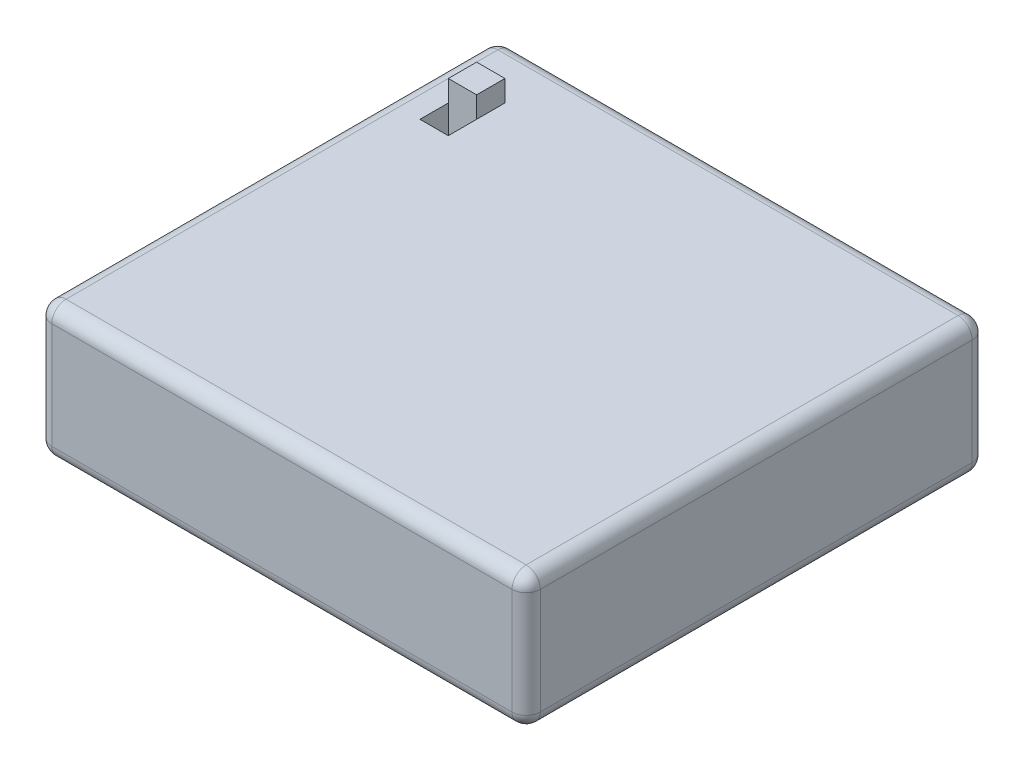
ISO-10303-21;
HEADER;
FILE_DESCRIPTION(('STEP AP214'),'2;1');
FILE_NAME('part.step','',(''),(''),'','','');
FILE_SCHEMA(('AUTOMOTIVE_DESIGN { 1 0 10303 214 1 1 1 1 }'));
ENDSEC;
DATA;
#1=APPLICATION_CONTEXT('core data for automotive mechanical design processes');
#2=APPLICATION_PROTOCOL_DEFINITION('international standard','automotive_design',2000,#1);
#3=PRODUCT_CONTEXT('',#1,'mechanical');
#4=PRODUCT('Part','Part','',(#3));
#5=PRODUCT_RELATED_PRODUCT_CATEGORY('part','',(#4));
#6=PRODUCT_DEFINITION_FORMATION('','',#4);
#7=PRODUCT_DEFINITION_CONTEXT('part definition',#1,'design');
#8=PRODUCT_DEFINITION('design','',#6,#7);
#9=PRODUCT_DEFINITION_SHAPE('','',#8);
#10=(LENGTH_UNIT() NAMED_UNIT(*) SI_UNIT(.MILLI.,.METRE.));
#11=(NAMED_UNIT(*) PLANE_ANGLE_UNIT() SI_UNIT($,.RADIAN.));
#12=(NAMED_UNIT(*) SI_UNIT($,.STERADIAN.) SOLID_ANGLE_UNIT());
#13=UNCERTAINTY_MEASURE_WITH_UNIT(LENGTH_MEASURE(1.E-05),#10,'distance_accuracy_value','');
#14=(GEOMETRIC_REPRESENTATION_CONTEXT(3) GLOBAL_UNCERTAINTY_ASSIGNED_CONTEXT((#13)) GLOBAL_UNIT_ASSIGNED_CONTEXT((#10,
#11,#12)) REPRESENTATION_CONTEXT('',''));
#15=CARTESIAN_POINT('',(0.,0.,0.));
#16=DIRECTION('',(0.,0.,1.));
#17=DIRECTION('',(1.,0.,0.));
#18=AXIS2_PLACEMENT_3D('',#15,#16,#17);
#19=CARTESIAN_POINT('',(-29.5,5.5,16.));
#20=DIRECTION('',(-1.,0.,0.));
#21=DIRECTION('',(0.,-1.,0.));
#22=AXIS2_PLACEMENT_3D('',#19,#20,#21);
#23=PLANE('',#22);
#24=DIRECTION('',(0.,-1.,0.));
#25=VECTOR('',#24,1.);
#26=CARTESIAN_POINT('',(-29.5,12.5,12.));
#27=LINE('',#26,#25);
#28=CARTESIAN_POINT('',(-29.5,9.5,12.));
#29=VERTEX_POINT('',#28);
#30=CARTESIAN_POINT('',(-29.5,5.5,12.));
#31=VERTEX_POINT('',#30);
#32=EDGE_CURVE('E48',#29,#31,#27,.T.);
#33=ORIENTED_EDGE('',*,*,#32,.F.);
#34=DIRECTION('',(0.,0.,1.));
#35=VECTOR('',#34,1.);
#36=CARTESIAN_POINT('',(-29.5,9.5,16.));
#37=LINE('',#36,#35);
#38=CARTESIAN_POINT('',(-29.5,9.5,16.));
#39=VERTEX_POINT('',#38);
#40=EDGE_CURVE('E55',#29,#39,#37,.T.);
#41=ORIENTED_EDGE('',*,*,#40,.T.);
#42=DIRECTION('',(0.,1.,0.));
#43=VECTOR('',#42,1.);
#44=CARTESIAN_POINT('',(-29.5,5.5,16.));
#45=LINE('',#44,#43);
#46=CARTESIAN_POINT('',(-29.5,5.5,16.));
#47=VERTEX_POINT('',#46);
#48=EDGE_CURVE('E203',#47,#39,#45,.T.);
#49=ORIENTED_EDGE('',*,*,#48,.F.);
#50=DIRECTION('',(0.,0.,1.));
#51=VECTOR('',#50,1.);
#52=CARTESIAN_POINT('',(-29.5,5.5,16.));
#53=LINE('',#52,#51);
#54=EDGE_CURVE('E194',#31,#47,#53,.T.);
#55=ORIENTED_EDGE('',*,*,#54,.F.);
#56=EDGE_LOOP('',(#33,#41,#49,#55));
#57=FACE_BOUND('',#56,.T.);
#58=ADVANCED_FACE('F33',(#57),#23,.F.);
#59=CARTESIAN_POINT('',(-25.5,5.5,16.));
#60=DIRECTION('',(1.,0.,0.));
#61=DIRECTION('',(0.,1.,0.));
#62=AXIS2_PLACEMENT_3D('',#59,#60,#61);
#63=PLANE('',#62);
#64=DIRECTION('',(0.,-1.,0.));
#65=VECTOR('',#64,1.);
#66=CARTESIAN_POINT('',(-25.5,12.5,12.));
#67=LINE('',#66,#65);
#68=CARTESIAN_POINT('',(-25.5,9.5,12.));
#69=VERTEX_POINT('',#68);
#70=CARTESIAN_POINT('',(-25.5,5.5,12.));
#71=VERTEX_POINT('',#70);
#72=EDGE_CURVE('E771',#69,#71,#67,.T.);
#73=ORIENTED_EDGE('',*,*,#72,.T.);
#74=DIRECTION('',(0.,0.,-1.));
#75=VECTOR('',#74,1.);
#76=CARTESIAN_POINT('',(-25.5,5.5,16.));
#77=LINE('',#76,#75);
#78=CARTESIAN_POINT('',(-25.5,5.5,16.));
#79=VERTEX_POINT('',#78);
#80=EDGE_CURVE('E200',#79,#71,#77,.T.);
#81=ORIENTED_EDGE('',*,*,#80,.F.);
#82=DIRECTION('',(0.,1.,0.));
#83=VECTOR('',#82,1.);
#84=CARTESIAN_POINT('',(-25.5,5.5,16.));
#85=LINE('',#84,#83);
#86=CARTESIAN_POINT('',(-25.5,9.5,16.));
#87=VERTEX_POINT('',#86);
#88=EDGE_CURVE('E212',#79,#87,#85,.T.);
#89=ORIENTED_EDGE('',*,*,#88,.T.);
#90=DIRECTION('',(0.,0.,-1.));
#91=VECTOR('',#90,1.);
#92=CARTESIAN_POINT('',(-25.5,9.5,16.));
#93=LINE('',#92,#91);
#94=EDGE_CURVE('E208',#87,#69,#93,.T.);
#95=ORIENTED_EDGE('',*,*,#94,.T.);
#96=EDGE_LOOP('',(#73,#81,#89,#95));
#97=FACE_BOUND('',#96,.T.);
#98=ADVANCED_FACE('F449',(#97),#63,.F.);
#99=CARTESIAN_POINT('',(0.,5.50000000000001,0.));
#100=DIRECTION('',(0.,1.,0.));
#101=DIRECTION('',(-1.,0.,0.));
#102=AXIS2_PLACEMENT_3D('',#99,#100,#101);
#103=PLANE('',#102);
#104=ORIENTED_EDGE('',*,*,#80,.T.);
#105=DIRECTION('',(1.,0.,0.));
#106=VECTOR('',#105,1.);
#107=CARTESIAN_POINT('',(-25.5,5.5,12.));
#108=LINE('',#107,#106);
#109=EDGE_CURVE('E183',#31,#71,#108,.T.);
#110=ORIENTED_EDGE('',*,*,#109,.F.);
#111=ORIENTED_EDGE('',*,*,#54,.T.);
#112=DIRECTION('',(1.,0.,0.));
#113=VECTOR('',#112,1.);
#114=CARTESIAN_POINT('',(-25.5,5.5,16.));
#115=LINE('',#114,#113);
#116=EDGE_CURVE('E196',#47,#79,#115,.T.);
#117=ORIENTED_EDGE('',*,*,#116,.T.);
#118=EDGE_LOOP('',(#104,#110,#111,#117));
#119=FACE_BOUND('',#118,.T.);
#120=ADVANCED_FACE('F455',(#119),#103,.T.);
#121=CARTESIAN_POINT('',(-32.5,7.5,65.));
#122=DIRECTION('',(0.,0.,-1.));
#123=DIRECTION('',(-1.,0.,0.));
#124=AXIS2_PLACEMENT_3D('',#121,#122,#123);
#125=CYLINDRICAL_SURFACE('',#124,2.);
#126=DIRECTION('',(0.,0.,-1.));
#127=VECTOR('',#126,1.);
#128=CARTESIAN_POINT('',(-34.5,7.49999999999998,65.));
#129=LINE('',#128,#127);
#130=CARTESIAN_POINT('',(-34.5,7.49999999999998,63.));
#131=VERTEX_POINT('',#130);
#132=CARTESIAN_POINT('',(-34.5,7.49999999999998,2.));
#133=VERTEX_POINT('',#132);
#134=EDGE_CURVE('E238',#131,#133,#129,.T.);
#135=ORIENTED_EDGE('',*,*,#134,.F.);
#136=CARTESIAN_POINT('',(-32.5,7.5,63.));
#137=DIRECTION('',(0.,0.,-1.));
#138=DIRECTION('',(-1.,0.,0.));
#139=AXIS2_PLACEMENT_3D('',#136,#137,#138);
#140=CIRCLE('',#139,2.);
#141=CARTESIAN_POINT('',(-32.5,9.5,63.));
#142=VERTEX_POINT('',#141);
#143=EDGE_CURVE('E278',#131,#142,#140,.T.);
#144=ORIENTED_EDGE('',*,*,#143,.T.);
#145=DIRECTION('',(0.,0.,-1.));
#146=VECTOR('',#145,1.);
#147=CARTESIAN_POINT('',(-32.5,9.5,65.));
#148=LINE('',#147,#146);
#149=CARTESIAN_POINT('',(-32.5,9.5,2.));
#150=VERTEX_POINT('',#149);
#151=EDGE_CURVE('E216',#142,#150,#148,.T.);
#152=ORIENTED_EDGE('',*,*,#151,.T.);
#153=CARTESIAN_POINT('',(-32.5,7.5,2.));
#154=DIRECTION('',(0.,0.,-1.));
#155=DIRECTION('',(-1.,0.,0.));
#156=AXIS2_PLACEMENT_3D('',#153,#154,#155);
#157=CIRCLE('',#156,2.);
#158=EDGE_CURVE('E276',#150,#133,#157,.F.);
#159=ORIENTED_EDGE('',*,*,#158,.T.);
#160=EDGE_LOOP('',(#135,#144,#152,#159));
#161=FACE_BOUND('',#160,.T.);
#162=ADVANCED_FACE('F343',(#161),#125,.T.);
#163=CARTESIAN_POINT('',(-34.5,-7.49999999999999,65.));
#164=DIRECTION('',(1.,0.,0.));
#165=DIRECTION('',(0.,0.,-1.));
#166=AXIS2_PLACEMENT_3D('',#163,#164,#165);
#167=PLANE('',#166);
#168=CARTESIAN_POINT('',(-34.5,0.,57.));
#169=DIRECTION('',(1.,0.,0.));
#170=DIRECTION('',(0.,0.,-1.));
#171=AXIS2_PLACEMENT_3D('',#168,#169,#170);
#172=CIRCLE('',#171,0.499999999999999);
#173=CARTESIAN_POINT('',(-34.5,0.,56.5));
#174=VERTEX_POINT('',#173);
#175=EDGE_CURVE('E11',#174,#174,#172,.F.);
#176=ORIENTED_EDGE('',*,*,#175,.F.);
#177=EDGE_LOOP('',(#176));
#178=FACE_BOUND('',#177,.T.);
#179=CARTESIAN_POINT('',(-34.5,0.,55.));
#180=DIRECTION('',(1.,0.,0.));
#181=DIRECTION('',(0.,0.,-1.));
#182=AXIS2_PLACEMENT_3D('',#179,#180,#181);
#183=CIRCLE('',#182,0.499999999999999);
#184=CARTESIAN_POINT('',(-34.5,0.,54.5));
#185=VERTEX_POINT('',#184);
#186=EDGE_CURVE('E41',#185,#185,#183,.F.);
#187=ORIENTED_EDGE('',*,*,#186,.F.);
#188=EDGE_LOOP('',(#187));
#189=FACE_BOUND('',#188,.T.);
#190=DIRECTION('',(0.,0.,-1.));
#191=VECTOR('',#190,1.);
#192=CARTESIAN_POINT('',(-34.5,-7.49999999999999,65.));
#193=LINE('',#192,#191);
#194=CARTESIAN_POINT('',(-34.5,-7.49999999999999,63.));
#195=VERTEX_POINT('',#194);
#196=CARTESIAN_POINT('',(-34.5,-7.49999999999999,2.));
#197=VERTEX_POINT('',#196);
#198=EDGE_CURVE('E235',#195,#197,#193,.T.);
#199=ORIENTED_EDGE('',*,*,#198,.F.);
#200=DIRECTION('',(0.,-1.,0.));
#201=VECTOR('',#200,1.);
#202=CARTESIAN_POINT('',(-34.5,7.49999999999998,63.));
#203=LINE('',#202,#201);
#204=EDGE_CURVE('E274',#195,#131,#203,.F.);
#205=ORIENTED_EDGE('',*,*,#204,.T.);
#206=ORIENTED_EDGE('',*,*,#134,.T.);
#207=DIRECTION('',(0.,-1.,0.));
#208=VECTOR('',#207,1.);
#209=CARTESIAN_POINT('',(-34.5,-7.49999999999999,2.));
#210=LINE('',#209,#208);
#211=EDGE_CURVE('E271',#133,#197,#210,.T.);
#212=ORIENTED_EDGE('',*,*,#211,.T.);
#213=EDGE_LOOP('',(#199,#205,#206,#212));
#214=FACE_BOUND('',#213,.T.);
#215=ADVANCED_FACE('F339',(#178,#189,#214),#167,.F.);
#216=CARTESIAN_POINT('',(-32.5,-7.5,65.));
#217=DIRECTION('',(0.,0.,-1.));
#218=DIRECTION('',(-1.,0.,0.));
#219=AXIS2_PLACEMENT_3D('',#216,#217,#218);
#220=CYLINDRICAL_SURFACE('',#219,2.);
#221=DIRECTION('',(0.,0.,-1.));
#222=VECTOR('',#221,1.);
#223=CARTESIAN_POINT('',(-32.5,-9.5,65.));
#224=LINE('',#223,#222);
#225=CARTESIAN_POINT('',(-32.5,-9.5,63.));
#226=VERTEX_POINT('',#225);
#227=CARTESIAN_POINT('',(-32.5,-9.5,2.));
#228=VERTEX_POINT('',#227);
#229=EDGE_CURVE('E232',#226,#228,#224,.T.);
#230=ORIENTED_EDGE('',*,*,#229,.F.);
#231=CARTESIAN_POINT('',(-32.5,-7.5,63.));
#232=DIRECTION('',(0.,0.,-1.));
#233=DIRECTION('',(-1.,0.,0.));
#234=AXIS2_PLACEMENT_3D('',#231,#232,#233);
#235=CIRCLE('',#234,2.);
#236=EDGE_CURVE('E269',#226,#195,#235,.T.);
#237=ORIENTED_EDGE('',*,*,#236,.T.);
#238=ORIENTED_EDGE('',*,*,#198,.T.);
#239=CARTESIAN_POINT('',(-32.5,-7.5,2.));
#240=DIRECTION('',(0.,0.,-1.));
#241=DIRECTION('',(-1.,0.,0.));
#242=AXIS2_PLACEMENT_3D('',#239,#240,#241);
#243=CIRCLE('',#242,2.);
#244=EDGE_CURVE('E267',#197,#228,#243,.F.);
#245=ORIENTED_EDGE('',*,*,#244,.T.);
#246=EDGE_LOOP('',(#230,#237,#238,#245));
#247=FACE_BOUND('',#246,.T.);
#248=ADVANCED_FACE('F342',(#247),#220,.T.);
#249=CARTESIAN_POINT('',(32.5,-9.49999999999999,65.));
#250=DIRECTION('',(0.,1.,0.));
#251=DIRECTION('',(-1.,0.,0.));
#252=AXIS2_PLACEMENT_3D('',#249,#250,#251);
#253=PLANE('',#252);
#254=DIRECTION('',(0.,0.,-1.));
#255=VECTOR('',#254,1.);
#256=CARTESIAN_POINT('',(32.5,-9.49999999999999,65.));
#257=LINE('',#256,#255);
#258=CARTESIAN_POINT('',(32.5,-9.49999999999999,63.));
#259=VERTEX_POINT('',#258);
#260=CARTESIAN_POINT('',(32.5,-9.49999999999999,2.));
#261=VERTEX_POINT('',#260);
#262=EDGE_CURVE('E229',#259,#261,#257,.T.);
#263=ORIENTED_EDGE('',*,*,#262,.F.);
#264=DIRECTION('',(1.,0.,0.));
#265=VECTOR('',#264,1.);
#266=CARTESIAN_POINT('',(-32.5,-9.5,63.));
#267=LINE('',#266,#265);
#268=EDGE_CURVE('E265',#259,#226,#267,.F.);
#269=ORIENTED_EDGE('',*,*,#268,.T.);
#270=ORIENTED_EDGE('',*,*,#229,.T.);
#271=DIRECTION('',(1.,0.,0.));
#272=VECTOR('',#271,1.);
#273=CARTESIAN_POINT('',(32.5,-9.49999999999999,2.));
#274=LINE('',#273,#272);
#275=EDGE_CURVE('E263',#228,#261,#274,.T.);
#276=ORIENTED_EDGE('',*,*,#275,.T.);
#277=EDGE_LOOP('',(#263,#269,#270,#276));
#278=FACE_BOUND('',#277,.T.);
#279=ADVANCED_FACE('F393',(#278),#253,.F.);
#280=CARTESIAN_POINT('',(32.5,-7.49999999999999,65.));
#281=DIRECTION('',(0.,0.,-1.));
#282=DIRECTION('',(-1.,0.,0.));
#283=AXIS2_PLACEMENT_3D('',#280,#281,#282);
#284=CYLINDRICAL_SURFACE('',#283,2.);
#285=DIRECTION('',(0.,0.,-1.));
#286=VECTOR('',#285,1.);
#287=CARTESIAN_POINT('',(34.5,-7.49999999999998,65.));
#288=LINE('',#287,#286);
#289=CARTESIAN_POINT('',(34.5,-7.49999999999998,63.));
#290=VERTEX_POINT('',#289);
#291=CARTESIAN_POINT('',(34.5,-7.49999999999998,2.));
#292=VERTEX_POINT('',#291);
#293=EDGE_CURVE('E226',#290,#292,#288,.T.);
#294=ORIENTED_EDGE('',*,*,#293,.F.);
#295=CARTESIAN_POINT('',(32.5,-7.49999999999999,63.));
#296=DIRECTION('',(0.,0.,-1.));
#297=DIRECTION('',(-1.,0.,0.));
#298=AXIS2_PLACEMENT_3D('',#295,#296,#297);
#299=CIRCLE('',#298,2.);
#300=EDGE_CURVE('E261',#290,#259,#299,.T.);
#301=ORIENTED_EDGE('',*,*,#300,.T.);
#302=ORIENTED_EDGE('',*,*,#262,.T.);
#303=CARTESIAN_POINT('',(32.5,-7.49999999999999,2.));
#304=DIRECTION('',(0.,0.,-1.));
#305=DIRECTION('',(-1.,0.,0.));
#306=AXIS2_PLACEMENT_3D('',#303,#304,#305);
#307=CIRCLE('',#306,2.);
#308=EDGE_CURVE('E259',#261,#292,#307,.F.);
#309=ORIENTED_EDGE('',*,*,#308,.T.);
#310=EDGE_LOOP('',(#294,#301,#302,#309));
#311=FACE_BOUND('',#310,.T.);
#312=ADVANCED_FACE('F405',(#311),#284,.T.);
#313=CARTESIAN_POINT('',(34.5,-7.49999999999998,65.));
#314=DIRECTION('',(-1.,0.,0.));
#315=DIRECTION('',(0.,0.,1.));
#316=AXIS2_PLACEMENT_3D('',#313,#314,#315);
#317=PLANE('',#316);
#318=DIRECTION('',(0.,0.,-1.));
#319=VECTOR('',#318,1.);
#320=CARTESIAN_POINT('',(34.5,7.49999999999999,65.));
#321=LINE('',#320,#319);
#322=CARTESIAN_POINT('',(34.5,7.49999999999999,63.));
#323=VERTEX_POINT('',#322);
#324=CARTESIAN_POINT('',(34.5,7.49999999999999,2.));
#325=VERTEX_POINT('',#324);
#326=EDGE_CURVE('E223',#323,#325,#321,.T.);
#327=ORIENTED_EDGE('',*,*,#326,.F.);
#328=DIRECTION('',(0.,1.,0.));
#329=VECTOR('',#328,1.);
#330=CARTESIAN_POINT('',(34.5,-7.49999999999998,63.));
#331=LINE('',#330,#329);
#332=EDGE_CURVE('E257',#323,#290,#331,.F.);
#333=ORIENTED_EDGE('',*,*,#332,.T.);
#334=ORIENTED_EDGE('',*,*,#293,.T.);
#335=DIRECTION('',(0.,1.,0.));
#336=VECTOR('',#335,1.);
#337=CARTESIAN_POINT('',(34.5,-7.49999999999998,2.));
#338=LINE('',#337,#336);
#339=EDGE_CURVE('E255',#292,#325,#338,.T.);
#340=ORIENTED_EDGE('',*,*,#339,.T.);
#341=EDGE_LOOP('',(#327,#333,#334,#340));
#342=FACE_BOUND('',#341,.T.);
#343=ADVANCED_FACE('F410',(#342),#317,.F.);
#344=CARTESIAN_POINT('',(32.5,7.50000000000001,65.));
#345=DIRECTION('',(0.,0.,-1.));
#346=DIRECTION('',(-1.,0.,0.));
#347=AXIS2_PLACEMENT_3D('',#344,#345,#346);
#348=CYLINDRICAL_SURFACE('',#347,2.);
#349=DIRECTION('',(0.,0.,-1.));
#350=VECTOR('',#349,1.);
#351=CARTESIAN_POINT('',(32.5,9.50000000000001,65.));
#352=LINE('',#351,#350);
#353=CARTESIAN_POINT('',(32.5,9.50000000000001,63.));
#354=VERTEX_POINT('',#353);
#355=CARTESIAN_POINT('',(32.5,9.50000000000001,2.));
#356=VERTEX_POINT('',#355);
#357=EDGE_CURVE('E219',#354,#356,#352,.T.);
#358=ORIENTED_EDGE('',*,*,#357,.F.);
#359=CARTESIAN_POINT('',(32.5,7.50000000000001,63.));
#360=DIRECTION('',(0.,0.,-1.));
#361=DIRECTION('',(-1.,0.,0.));
#362=AXIS2_PLACEMENT_3D('',#359,#360,#361);
#363=CIRCLE('',#362,2.);
#364=EDGE_CURVE('E243',#354,#323,#363,.T.);
#365=ORIENTED_EDGE('',*,*,#364,.T.);
#366=ORIENTED_EDGE('',*,*,#326,.T.);
#367=CARTESIAN_POINT('',(32.5,7.50000000000001,2.));
#368=DIRECTION('',(0.,0.,-1.));
#369=DIRECTION('',(-1.,0.,0.));
#370=AXIS2_PLACEMENT_3D('',#367,#368,#369);
#371=CIRCLE('',#370,2.);
#372=EDGE_CURVE('E241',#325,#356,#371,.F.);
#373=ORIENTED_EDGE('',*,*,#372,.T.);
#374=EDGE_LOOP('',(#358,#365,#366,#373));
#375=FACE_BOUND('',#374,.T.);
#376=ADVANCED_FACE('F419',(#375),#348,.T.);
#377=CARTESIAN_POINT('',(32.5,9.50000000000001,65.));
#378=DIRECTION('',(0.,-1.,0.));
#379=DIRECTION('',(1.,0.,0.));
#380=AXIS2_PLACEMENT_3D('',#377,#378,#379);
#381=PLANE('',#380);
#382=DIRECTION('',(1.,0.,0.));
#383=VECTOR('',#382,1.);
#384=CARTESIAN_POINT('',(-25.5,9.5,16.));
#385=LINE('',#384,#383);
#386=EDGE_CURVE('E205',#39,#87,#385,.T.);
#387=ORIENTED_EDGE('',*,*,#386,.F.);
#388=ORIENTED_EDGE('',*,*,#40,.F.);
#389=CARTESIAN_POINT('',(-29.5,9.5,8.));
#390=VERTEX_POINT('',#389);
#391=EDGE_CURVE('E187',#390,#29,#37,.T.);
#392=ORIENTED_EDGE('',*,*,#391,.F.);
#393=DIRECTION('',(-1.,0.,0.));
#394=VECTOR('',#393,1.);
#395=CARTESIAN_POINT('',(-25.5,9.5,8.));
#396=LINE('',#395,#394);
#397=CARTESIAN_POINT('',(-25.5,9.5,8.));
#398=VERTEX_POINT('',#397);
#399=EDGE_CURVE('E197',#398,#390,#396,.T.);
#400=ORIENTED_EDGE('',*,*,#399,.F.);
#401=DIRECTION('',(0.,0.,-1.));
#402=VECTOR('',#401,1.);
#403=CARTESIAN_POINT('',(-25.5,9.5,65.));
#404=LINE('',#403,#402);
#405=EDGE_CURVE('E188',#69,#398,#404,.T.);
#406=ORIENTED_EDGE('',*,*,#405,.F.);
#407=ORIENTED_EDGE('',*,*,#94,.F.);
#408=EDGE_LOOP('',(#387,#388,#392,#400,#406,#407));
#409=FACE_BOUND('',#408,.T.);
#410=ORIENTED_EDGE('',*,*,#151,.F.);
#411=DIRECTION('',(-1.,0.,0.));
#412=VECTOR('',#411,1.);
#413=CARTESIAN_POINT('',(32.5,9.50000000000001,63.));
#414=LINE('',#413,#412);
#415=EDGE_CURVE('E291',#142,#354,#414,.F.);
#416=ORIENTED_EDGE('',*,*,#415,.T.);
#417=ORIENTED_EDGE('',*,*,#357,.T.);
#418=DIRECTION('',(-1.,0.,0.));
#419=VECTOR('',#418,1.);
#420=CARTESIAN_POINT('',(32.5,9.50000000000001,2.));
#421=LINE('',#420,#419);
#422=EDGE_CURVE('E289',#356,#150,#421,.T.);
#423=ORIENTED_EDGE('',*,*,#422,.T.);
#424=EDGE_LOOP('',(#410,#416,#417,#423));
#425=FACE_BOUND('',#424,.T.);
#426=ADVANCED_FACE('F370',(#409,#425),#381,.F.);
#427=CARTESIAN_POINT('',(-32.5,7.5,65.));
#428=DIRECTION('',(0.,0.,1.));
#429=DIRECTION('',(1.,0.,0.));
#430=AXIS2_PLACEMENT_3D('',#427,#428,#429);
#431=PLANE('',#430);
#432=DIRECTION('',(1.,0.,0.));
#433=VECTOR('',#432,1.);
#434=CARTESIAN_POINT('',(32.5,-7.49999999999999,65.));
#435=LINE('',#434,#433);
#436=CARTESIAN_POINT('',(-32.5,-7.5,65.));
#437=VERTEX_POINT('',#436);
#438=CARTESIAN_POINT('',(32.5,-7.49999999999999,65.));
#439=VERTEX_POINT('',#438);
#440=EDGE_CURVE('E250',#437,#439,#435,.T.);
#441=ORIENTED_EDGE('',*,*,#440,.T.);
#442=DIRECTION('',(0.,1.,0.));
#443=VECTOR('',#442,1.);
#444=CARTESIAN_POINT('',(32.5,7.49999999999999,65.));
#445=LINE('',#444,#443);
#446=CARTESIAN_POINT('',(32.5,7.50000000000001,65.));
#447=VERTEX_POINT('',#446);
#448=EDGE_CURVE('E252',#439,#447,#445,.T.);
#449=ORIENTED_EDGE('',*,*,#448,.T.);
#450=DIRECTION('',(-1.,0.,0.));
#451=VECTOR('',#450,1.);
#452=CARTESIAN_POINT('',(-32.5,7.5,65.));
#453=LINE('',#452,#451);
#454=CARTESIAN_POINT('',(-32.5,7.5,65.));
#455=VERTEX_POINT('',#454);
#456=EDGE_CURVE('E246',#447,#455,#453,.T.);
#457=ORIENTED_EDGE('',*,*,#456,.T.);
#458=DIRECTION('',(0.,-1.,0.));
#459=VECTOR('',#458,1.);
#460=CARTESIAN_POINT('',(-32.5,-7.49999999999999,65.));
#461=LINE('',#460,#459);
#462=EDGE_CURVE('E248',#455,#437,#461,.T.);
#463=ORIENTED_EDGE('',*,*,#462,.T.);
#464=EDGE_LOOP('',(#441,#449,#457,#463));
#465=FACE_BOUND('',#464,.T.);
#466=ADVANCED_FACE('F430',(#465),#431,.T.);
#467=CARTESIAN_POINT('',(-32.5,7.5,0.));
#468=DIRECTION('',(0.,0.,1.));
#469=DIRECTION('',(1.,0.,0.));
#470=AXIS2_PLACEMENT_3D('',#467,#468,#469);
#471=PLANE('',#470);
#472=DIRECTION('',(1.,0.,0.));
#473=VECTOR('',#472,1.);
#474=CARTESIAN_POINT('',(-32.5,-7.5,0.));
#475=LINE('',#474,#473);
#476=CARTESIAN_POINT('',(32.5,-7.49999999999999,0.));
#477=VERTEX_POINT('',#476);
#478=CARTESIAN_POINT('',(-32.5,-7.5,0.));
#479=VERTEX_POINT('',#478);
#480=EDGE_CURVE('E284',#477,#479,#475,.F.);
#481=ORIENTED_EDGE('',*,*,#480,.T.);
#482=DIRECTION('',(0.,-1.,0.));
#483=VECTOR('',#482,1.);
#484=CARTESIAN_POINT('',(-32.5,7.5,0.));
#485=LINE('',#484,#483);
#486=CARTESIAN_POINT('',(-32.5,7.5,0.));
#487=VERTEX_POINT('',#486);
#488=EDGE_CURVE('E286',#479,#487,#485,.F.);
#489=ORIENTED_EDGE('',*,*,#488,.T.);
#490=DIRECTION('',(-1.,0.,0.));
#491=VECTOR('',#490,1.);
#492=CARTESIAN_POINT('',(-32.5,7.5,0.));
#493=LINE('',#492,#491);
#494=CARTESIAN_POINT('',(32.5,7.50000000000001,0.));
#495=VERTEX_POINT('',#494);
#496=EDGE_CURVE('E280',#487,#495,#493,.F.);
#497=ORIENTED_EDGE('',*,*,#496,.T.);
#498=DIRECTION('',(0.,1.,0.));
#499=VECTOR('',#498,1.);
#500=CARTESIAN_POINT('',(32.5,7.5,0.));
#501=LINE('',#500,#499);
#502=EDGE_CURVE('E282',#495,#477,#501,.F.);
#503=ORIENTED_EDGE('',*,*,#502,.T.);
#504=EDGE_LOOP('',(#481,#489,#497,#503));
#505=FACE_BOUND('',#504,.T.);
#506=ADVANCED_FACE('F446',(#505),#471,.F.);
#507=CARTESIAN_POINT('',(-32.5,-7.5,63.));
#508=DIRECTION('',(0.,0.,1.));
#509=DIRECTION('',(1.,0.,0.));
#510=AXIS2_PLACEMENT_3D('',#507,#508,#509);
#511=SPHERICAL_SURFACE('',#510,2.);
#512=CARTESIAN_POINT('',(-32.5,-7.5,63.));
#513=DIRECTION('',(0.,1.,0.));
#514=DIRECTION('',(-1.,0.,0.));
#515=AXIS2_PLACEMENT_3D('',#512,#513,#514);
#516=CIRCLE('',#515,2.);
#517=EDGE_CURVE('E310',#195,#437,#516,.T.);
#518=ORIENTED_EDGE('',*,*,#517,.F.);
#519=ORIENTED_EDGE('',*,*,#236,.F.);
#520=CARTESIAN_POINT('',(-32.5,-7.5,63.));
#521=DIRECTION('',(1.,0.,0.));
#522=DIRECTION('',(0.,1.,0.));
#523=AXIS2_PLACEMENT_3D('',#520,#521,#522);
#524=CIRCLE('',#523,2.);
#525=EDGE_CURVE('E220',#437,#226,#524,.T.);
#526=ORIENTED_EDGE('',*,*,#525,.F.);
#527=EDGE_LOOP('',(#518,#519,#526));
#528=FACE_BOUND('',#527,.T.);
#529=ADVANCED_FACE('F355',(#528),#511,.T.);
#530=CARTESIAN_POINT('',(-32.5,-7.5,63.));
#531=DIRECTION('',(-1.,0.,0.));
#532=DIRECTION('',(0.,-1.,0.));
#533=AXIS2_PLACEMENT_3D('',#530,#531,#532);
#534=CYLINDRICAL_SURFACE('',#533,2.);
#535=ORIENTED_EDGE('',*,*,#525,.T.);
#536=ORIENTED_EDGE('',*,*,#268,.F.);
#537=CARTESIAN_POINT('',(32.5,-7.49999999999999,63.));
#538=DIRECTION('',(1.,0.,0.));
#539=DIRECTION('',(0.,1.,0.));
#540=AXIS2_PLACEMENT_3D('',#537,#538,#539);
#541=CIRCLE('',#540,2.);
#542=EDGE_CURVE('E307',#439,#259,#541,.T.);
#543=ORIENTED_EDGE('',*,*,#542,.F.);
#544=ORIENTED_EDGE('',*,*,#440,.F.);
#545=EDGE_LOOP('',(#535,#536,#543,#544));
#546=FACE_BOUND('',#545,.T.);
#547=ADVANCED_FACE('F438',(#546),#534,.T.);
#548=CARTESIAN_POINT('',(-32.5,7.5,63.));
#549=DIRECTION('',(0.,1.,0.));
#550=DIRECTION('',(0.,0.,1.));
#551=AXIS2_PLACEMENT_3D('',#548,#549,#550);
#552=CYLINDRICAL_SURFACE('',#551,2.);
#553=ORIENTED_EDGE('',*,*,#517,.T.);
#554=ORIENTED_EDGE('',*,*,#462,.F.);
#555=CARTESIAN_POINT('',(-32.5,7.49999999999998,63.));
#556=DIRECTION('',(0.,1.,0.));
#557=DIRECTION('',(0.,0.,1.));
#558=AXIS2_PLACEMENT_3D('',#555,#556,#557);
#559=CIRCLE('',#558,2.);
#560=EDGE_CURVE('E304',#131,#455,#559,.T.);
#561=ORIENTED_EDGE('',*,*,#560,.F.);
#562=ORIENTED_EDGE('',*,*,#204,.F.);
#563=EDGE_LOOP('',(#553,#554,#561,#562));
#564=FACE_BOUND('',#563,.T.);
#565=ADVANCED_FACE('F360',(#564),#552,.T.);
#566=CARTESIAN_POINT('',(32.5,-7.49999999999999,63.));
#567=DIRECTION('',(0.,0.,1.));
#568=DIRECTION('',(1.,0.,0.));
#569=AXIS2_PLACEMENT_3D('',#566,#567,#568);
#570=SPHERICAL_SURFACE('',#569,2.);
#571=ORIENTED_EDGE('',*,*,#542,.T.);
#572=ORIENTED_EDGE('',*,*,#300,.F.);
#573=CARTESIAN_POINT('',(32.5,-7.49999999999999,63.));
#574=DIRECTION('',(0.,1.,0.));
#575=DIRECTION('',(-1.,0.,0.));
#576=AXIS2_PLACEMENT_3D('',#573,#574,#575);
#577=CIRCLE('',#576,2.);
#578=EDGE_CURVE('E301',#439,#290,#577,.T.);
#579=ORIENTED_EDGE('',*,*,#578,.F.);
#580=EDGE_LOOP('',(#571,#572,#579));
#581=FACE_BOUND('',#580,.T.);
#582=ADVANCED_FACE('F436',(#581),#570,.T.);
#583=CARTESIAN_POINT('',(-32.5,7.5,63.));
#584=DIRECTION('',(0.,0.,1.));
#585=DIRECTION('',(1.,0.,0.));
#586=AXIS2_PLACEMENT_3D('',#583,#584,#585);
#587=SPHERICAL_SURFACE('',#586,2.);
#588=ORIENTED_EDGE('',*,*,#143,.F.);
#589=ORIENTED_EDGE('',*,*,#560,.T.);
#590=CARTESIAN_POINT('',(-32.5,7.5,63.));
#591=DIRECTION('',(1.,0.,0.));
#592=DIRECTION('',(0.,1.,0.));
#593=AXIS2_PLACEMENT_3D('',#590,#591,#592);
#594=CIRCLE('',#593,2.);
#595=EDGE_CURVE('E298',#142,#455,#594,.T.);
#596=ORIENTED_EDGE('',*,*,#595,.F.);
#597=EDGE_LOOP('',(#588,#589,#596));
#598=FACE_BOUND('',#597,.T.);
#599=ADVANCED_FACE('F364',(#598),#587,.T.);
#600=CARTESIAN_POINT('',(32.5,7.5,63.));
#601=DIRECTION('',(0.,-1.,0.));
#602=DIRECTION('',(0.,0.,-1.));
#603=AXIS2_PLACEMENT_3D('',#600,#601,#602);
#604=CYLINDRICAL_SURFACE('',#603,2.);
#605=ORIENTED_EDGE('',*,*,#578,.T.);
#606=ORIENTED_EDGE('',*,*,#332,.F.);
#607=CARTESIAN_POINT('',(32.5,7.50000000000001,63.));
#608=DIRECTION('',(0.,1.,0.));
#609=DIRECTION('',(-1.,0.,0.));
#610=AXIS2_PLACEMENT_3D('',#607,#608,#609);
#611=CIRCLE('',#610,2.);
#612=EDGE_CURVE('E295',#447,#323,#611,.T.);
#613=ORIENTED_EDGE('',*,*,#612,.F.);
#614=ORIENTED_EDGE('',*,*,#448,.F.);
#615=EDGE_LOOP('',(#605,#606,#613,#614));
#616=FACE_BOUND('',#615,.T.);
#617=ADVANCED_FACE('F433',(#616),#604,.T.);
#618=CARTESIAN_POINT('',(-32.5,7.5,63.));
#619=DIRECTION('',(1.,0.,0.));
#620=DIRECTION('',(0.,1.,0.));
#621=AXIS2_PLACEMENT_3D('',#618,#619,#620);
#622=CYLINDRICAL_SURFACE('',#621,2.);
#623=ORIENTED_EDGE('',*,*,#595,.T.);
#624=ORIENTED_EDGE('',*,*,#456,.F.);
#625=CARTESIAN_POINT('',(32.5,7.50000000000001,63.));
#626=DIRECTION('',(1.,0.,0.));
#627=DIRECTION('',(0.,0.,-1.));
#628=AXIS2_PLACEMENT_3D('',#625,#626,#627);
#629=CIRCLE('',#628,2.);
#630=EDGE_CURVE('E293',#354,#447,#629,.T.);
#631=ORIENTED_EDGE('',*,*,#630,.F.);
#632=ORIENTED_EDGE('',*,*,#415,.F.);
#633=EDGE_LOOP('',(#623,#624,#631,#632));
#634=FACE_BOUND('',#633,.T.);
#635=ADVANCED_FACE('F427',(#634),#622,.T.);
#636=CARTESIAN_POINT('',(32.5,7.50000000000001,63.));
#637=DIRECTION('',(0.,0.,1.));
#638=DIRECTION('',(1.,0.,0.));
#639=AXIS2_PLACEMENT_3D('',#636,#637,#638);
#640=SPHERICAL_SURFACE('',#639,2.);
#641=ORIENTED_EDGE('',*,*,#612,.T.);
#642=ORIENTED_EDGE('',*,*,#364,.F.);
#643=ORIENTED_EDGE('',*,*,#630,.T.);
#644=EDGE_LOOP('',(#641,#642,#643));
#645=FACE_BOUND('',#644,.T.);
#646=ADVANCED_FACE('F423',(#645),#640,.T.);
#647=CARTESIAN_POINT('',(32.5,-7.49999999999998,2.));
#648=DIRECTION('',(0.,1.,0.));
#649=DIRECTION('',(0.,0.,1.));
#650=AXIS2_PLACEMENT_3D('',#647,#648,#649);
#651=CYLINDRICAL_SURFACE('',#650,2.);
#652=CARTESIAN_POINT('',(32.5,7.49999999999999,2.));
#653=DIRECTION('',(0.,1.,0.));
#654=DIRECTION('',(0.,0.,1.));
#655=AXIS2_PLACEMENT_3D('',#652,#653,#654);
#656=CIRCLE('',#655,2.);
#657=EDGE_CURVE('E296',#325,#495,#656,.T.);
#658=ORIENTED_EDGE('',*,*,#657,.F.);
#659=ORIENTED_EDGE('',*,*,#339,.F.);
#660=CARTESIAN_POINT('',(32.5,-7.49999999999999,2.));
#661=DIRECTION('',(0.,-1.,0.));
#662=DIRECTION('',(1.,0.,0.));
#663=AXIS2_PLACEMENT_3D('',#660,#661,#662);
#664=CIRCLE('',#663,2.);
#665=EDGE_CURVE('E330',#477,#292,#664,.T.);
#666=ORIENTED_EDGE('',*,*,#665,.F.);
#667=ORIENTED_EDGE('',*,*,#502,.F.);
#668=EDGE_LOOP('',(#658,#659,#666,#667));
#669=FACE_BOUND('',#668,.T.);
#670=ADVANCED_FACE('F35',(#669),#651,.T.);
#671=CARTESIAN_POINT('',(32.5,7.50000000000001,2.));
#672=DIRECTION('',(0.,0.,1.));
#673=DIRECTION('',(1.,0.,0.));
#674=AXIS2_PLACEMENT_3D('',#671,#672,#673);
#675=SPHERICAL_SURFACE('',#674,2.);
#676=ORIENTED_EDGE('',*,*,#372,.F.);
#677=ORIENTED_EDGE('',*,*,#657,.T.);
#678=CARTESIAN_POINT('',(32.5,7.50000000000001,2.));
#679=DIRECTION('',(-1.,0.,0.));
#680=DIRECTION('',(0.,-1.,0.));
#681=AXIS2_PLACEMENT_3D('',#678,#679,#680);
#682=CIRCLE('',#681,2.);
#683=EDGE_CURVE('E327',#356,#495,#682,.T.);
#684=ORIENTED_EDGE('',*,*,#683,.F.);
#685=EDGE_LOOP('',(#676,#677,#684));
#686=FACE_BOUND('',#685,.T.);
#687=ADVANCED_FACE('F417',(#686),#675,.T.);
#688=CARTESIAN_POINT('',(32.5,-7.49999999999999,2.));
#689=DIRECTION('',(0.,0.,1.));
#690=DIRECTION('',(1.,0.,0.));
#691=AXIS2_PLACEMENT_3D('',#688,#689,#690);
#692=SPHERICAL_SURFACE('',#691,2.);
#693=ORIENTED_EDGE('',*,*,#665,.T.);
#694=ORIENTED_EDGE('',*,*,#308,.F.);
#695=CARTESIAN_POINT('',(32.5,-7.49999999999999,2.));
#696=DIRECTION('',(-1.,0.,0.));
#697=DIRECTION('',(0.,-1.,0.));
#698=AXIS2_PLACEMENT_3D('',#695,#696,#697);
#699=CIRCLE('',#698,2.);
#700=EDGE_CURVE('E324',#477,#261,#699,.T.);
#701=ORIENTED_EDGE('',*,*,#700,.F.);
#702=EDGE_LOOP('',(#693,#694,#701));
#703=FACE_BOUND('',#702,.T.);
#704=ADVANCED_FACE('F401',(#703),#692,.T.);
#705=CARTESIAN_POINT('',(32.5,7.50000000000001,2.));
#706=DIRECTION('',(-1.,0.,0.));
#707=DIRECTION('',(0.,-1.,0.));
#708=AXIS2_PLACEMENT_3D('',#705,#706,#707);
#709=CYLINDRICAL_SURFACE('',#708,2.);
#710=ORIENTED_EDGE('',*,*,#683,.T.);
#711=ORIENTED_EDGE('',*,*,#496,.F.);
#712=CARTESIAN_POINT('',(-32.5,7.5,2.));
#713=DIRECTION('',(-1.,0.,0.));
#714=DIRECTION('',(0.,0.,1.));
#715=AXIS2_PLACEMENT_3D('',#712,#713,#714);
#716=CIRCLE('',#715,2.);
#717=EDGE_CURVE('E321',#150,#487,#716,.T.);
#718=ORIENTED_EDGE('',*,*,#717,.F.);
#719=ORIENTED_EDGE('',*,*,#422,.F.);
#720=EDGE_LOOP('',(#710,#711,#718,#719));
#721=FACE_BOUND('',#720,.T.);
#722=ADVANCED_FACE('F375',(#721),#709,.T.);
#723=CARTESIAN_POINT('',(32.5,-7.49999999999999,2.));
#724=DIRECTION('',(1.,0.,0.));
#725=DIRECTION('',(0.,1.,0.));
#726=AXIS2_PLACEMENT_3D('',#723,#724,#725);
#727=CYLINDRICAL_SURFACE('',#726,2.);
#728=ORIENTED_EDGE('',*,*,#700,.T.);
#729=ORIENTED_EDGE('',*,*,#275,.F.);
#730=CARTESIAN_POINT('',(-32.5,-7.5,2.));
#731=DIRECTION('',(-1.,0.,0.));
#732=DIRECTION('',(0.,-1.,0.));
#733=AXIS2_PLACEMENT_3D('',#730,#731,#732);
#734=CIRCLE('',#733,2.);
#735=EDGE_CURVE('E318',#479,#228,#734,.T.);
#736=ORIENTED_EDGE('',*,*,#735,.F.);
#737=ORIENTED_EDGE('',*,*,#480,.F.);
#738=EDGE_LOOP('',(#728,#729,#736,#737));
#739=FACE_BOUND('',#738,.T.);
#740=ADVANCED_FACE('F396',(#739),#727,.T.);
#741=CARTESIAN_POINT('',(-32.5,7.5,2.));
#742=DIRECTION('',(0.,0.,1.));
#743=DIRECTION('',(1.,0.,0.));
#744=AXIS2_PLACEMENT_3D('',#741,#742,#743);
#745=SPHERICAL_SURFACE('',#744,2.);
#746=ORIENTED_EDGE('',*,*,#158,.F.);
#747=ORIENTED_EDGE('',*,*,#717,.T.);
#748=CARTESIAN_POINT('',(-32.5,7.5,2.));
#749=DIRECTION('',(0.,-1.,0.));
#750=DIRECTION('',(1.,0.,0.));
#751=AXIS2_PLACEMENT_3D('',#748,#749,#750);
#752=CIRCLE('',#751,2.);
#753=EDGE_CURVE('E316',#133,#487,#752,.T.);
#754=ORIENTED_EDGE('',*,*,#753,.F.);
#755=EDGE_LOOP('',(#746,#747,#754));
#756=FACE_BOUND('',#755,.T.);
#757=ADVANCED_FACE('F380',(#756),#745,.T.);
#758=CARTESIAN_POINT('',(-32.5,-7.5,2.));
#759=DIRECTION('',(0.,0.,1.));
#760=DIRECTION('',(1.,0.,0.));
#761=AXIS2_PLACEMENT_3D('',#758,#759,#760);
#762=SPHERICAL_SURFACE('',#761,2.);
#763=ORIENTED_EDGE('',*,*,#735,.T.);
#764=ORIENTED_EDGE('',*,*,#244,.F.);
#765=CARTESIAN_POINT('',(-32.5,-7.5,2.));
#766=DIRECTION('',(0.,1.,0.));
#767=DIRECTION('',(-1.,0.,0.));
#768=AXIS2_PLACEMENT_3D('',#765,#766,#767);
#769=CIRCLE('',#768,2.);
#770=EDGE_CURVE('E214',#479,#197,#769,.T.);
#771=ORIENTED_EDGE('',*,*,#770,.F.);
#772=EDGE_LOOP('',(#763,#764,#771));
#773=FACE_BOUND('',#772,.T.);
#774=ADVANCED_FACE('F387',(#773),#762,.T.);
#775=CARTESIAN_POINT('',(-32.5,-7.49999999999999,2.));
#776=DIRECTION('',(0.,-1.,0.));
#777=DIRECTION('',(0.,0.,-1.));
#778=AXIS2_PLACEMENT_3D('',#775,#776,#777);
#779=CYLINDRICAL_SURFACE('',#778,2.);
#780=ORIENTED_EDGE('',*,*,#753,.T.);
#781=ORIENTED_EDGE('',*,*,#488,.F.);
#782=ORIENTED_EDGE('',*,*,#770,.T.);
#783=ORIENTED_EDGE('',*,*,#211,.F.);
#784=EDGE_LOOP('',(#780,#781,#782,#783));
#785=FACE_BOUND('',#784,.T.);
#786=ADVANCED_FACE('F383',(#785),#779,.T.);
#787=CARTESIAN_POINT('',(-25.5,5.5,16.));
#788=DIRECTION('',(0.,0.,1.));
#789=DIRECTION('',(1.,0.,0.));
#790=AXIS2_PLACEMENT_3D('',#787,#788,#789);
#791=PLANE('',#790);
#792=ORIENTED_EDGE('',*,*,#386,.T.);
#793=ORIENTED_EDGE('',*,*,#88,.F.);
#794=ORIENTED_EDGE('',*,*,#116,.F.);
#795=ORIENTED_EDGE('',*,*,#48,.T.);
#796=EDGE_LOOP('',(#792,#793,#794,#795));
#797=FACE_BOUND('',#796,.T.);
#798=ADVANCED_FACE('F460',(#797),#791,.F.);
#799=CARTESIAN_POINT('',(-29.5,12.5,12.));
#800=DIRECTION('',(1.,0.,0.));
#801=DIRECTION('',(0.,1.,0.));
#802=AXIS2_PLACEMENT_3D('',#799,#800,#801);
#803=PLANE('',#802);
#804=DIRECTION('',(0.,-1.,0.));
#805=VECTOR('',#804,1.);
#806=CARTESIAN_POINT('',(-29.5,12.5,8.));
#807=LINE('',#806,#805);
#808=CARTESIAN_POINT('',(-29.5,12.5,8.));
#809=VERTEX_POINT('',#808);
#810=EDGE_CURVE('E775',#809,#390,#807,.T.);
#811=ORIENTED_EDGE('',*,*,#810,.T.);
#812=ORIENTED_EDGE('',*,*,#391,.T.);
#813=CARTESIAN_POINT('',(-29.5,12.5,12.));
#814=VERTEX_POINT('',#813);
#815=EDGE_CURVE('E168',#814,#29,#27,.T.);
#816=ORIENTED_EDGE('',*,*,#815,.F.);
#817=DIRECTION('',(0.,0.,1.));
#818=VECTOR('',#817,1.);
#819=CARTESIAN_POINT('',(-29.5,12.5,12.));
#820=LINE('',#819,#818);
#821=EDGE_CURVE('E174',#809,#814,#820,.T.);
#822=ORIENTED_EDGE('',*,*,#821,.F.);
#823=EDGE_LOOP('',(#811,#812,#816,#822));
#824=FACE_BOUND('',#823,.T.);
#825=ADVANCED_FACE('F185',(#824),#803,.F.);
#826=CARTESIAN_POINT('',(-25.5,12.5,12.));
#827=DIRECTION('',(-1.,0.,0.));
#828=DIRECTION('',(0.,-1.,0.));
#829=AXIS2_PLACEMENT_3D('',#826,#827,#828);
#830=PLANE('',#829);
#831=CARTESIAN_POINT('',(-25.5,12.5,12.));
#832=VERTEX_POINT('',#831);
#833=EDGE_CURVE('E170',#832,#69,#67,.T.);
#834=ORIENTED_EDGE('',*,*,#833,.T.);
#835=ORIENTED_EDGE('',*,*,#405,.T.);
#836=DIRECTION('',(0.,-1.,0.));
#837=VECTOR('',#836,1.);
#838=CARTESIAN_POINT('',(-25.5,12.5,8.));
#839=LINE('',#838,#837);
#840=CARTESIAN_POINT('',(-25.5,12.5,8.));
#841=VERTEX_POINT('',#840);
#842=EDGE_CURVE('E773',#841,#398,#839,.T.);
#843=ORIENTED_EDGE('',*,*,#842,.F.);
#844=DIRECTION('',(0.,0.,-1.));
#845=VECTOR('',#844,1.);
#846=CARTESIAN_POINT('',(-25.5,12.5,12.));
#847=LINE('',#846,#845);
#848=EDGE_CURVE('E173',#832,#841,#847,.T.);
#849=ORIENTED_EDGE('',*,*,#848,.F.);
#850=EDGE_LOOP('',(#834,#835,#843,#849));
#851=FACE_BOUND('',#850,.T.);
#852=ADVANCED_FACE('F568',(#851),#830,.F.);
#853=CARTESIAN_POINT('',(-25.5,12.5,8.));
#854=DIRECTION('',(0.,0.,1.));
#855=DIRECTION('',(1.,0.,0.));
#856=AXIS2_PLACEMENT_3D('',#853,#854,#855);
#857=PLANE('',#856);
#858=ORIENTED_EDGE('',*,*,#842,.T.);
#859=ORIENTED_EDGE('',*,*,#399,.T.);
#860=ORIENTED_EDGE('',*,*,#810,.F.);
#861=DIRECTION('',(-1.,0.,0.));
#862=VECTOR('',#861,1.);
#863=CARTESIAN_POINT('',(-25.5,12.5,8.));
#864=LINE('',#863,#862);
#865=EDGE_CURVE('E179',#841,#809,#864,.T.);
#866=ORIENTED_EDGE('',*,*,#865,.F.);
#867=EDGE_LOOP('',(#858,#859,#860,#866));
#868=FACE_BOUND('',#867,.T.);
#869=ADVANCED_FACE('F575',(#868),#857,.F.);
#870=CARTESIAN_POINT('',(-25.5,12.5,12.));
#871=DIRECTION('',(0.,0.,-1.));
#872=DIRECTION('',(-1.,0.,0.));
#873=AXIS2_PLACEMENT_3D('',#870,#871,#872);
#874=PLANE('',#873);
#875=ORIENTED_EDGE('',*,*,#109,.T.);
#876=ORIENTED_EDGE('',*,*,#72,.F.);
#877=ORIENTED_EDGE('',*,*,#833,.F.);
#878=DIRECTION('',(1.,0.,0.));
#879=VECTOR('',#878,1.);
#880=CARTESIAN_POINT('',(-25.5,12.5,12.));
#881=LINE('',#880,#879);
#882=EDGE_CURVE('E164',#814,#832,#881,.T.);
#883=ORIENTED_EDGE('',*,*,#882,.F.);
#884=ORIENTED_EDGE('',*,*,#815,.T.);
#885=ORIENTED_EDGE('',*,*,#32,.T.);
#886=EDGE_LOOP('',(#875,#876,#877,#883,#884,#885));
#887=FACE_BOUND('',#886,.T.);
#888=ADVANCED_FACE('F166',(#887),#874,.F.);
#889=CARTESIAN_POINT('',(0.,12.5,0.));
#890=DIRECTION('',(0.,1.,0.));
#891=DIRECTION('',(-1.,0.,0.));
#892=AXIS2_PLACEMENT_3D('',#889,#890,#891);
#893=PLANE('',#892);
#894=ORIENTED_EDGE('',*,*,#821,.T.);
#895=ORIENTED_EDGE('',*,*,#882,.T.);
#896=ORIENTED_EDGE('',*,*,#848,.T.);
#897=ORIENTED_EDGE('',*,*,#865,.T.);
#898=EDGE_LOOP('',(#894,#895,#896,#897));
#899=FACE_BOUND('',#898,.T.);
#900=ADVANCED_FACE('F177',(#899),#893,.T.);
#901=CARTESIAN_POINT('',(-39.5,0.,55.));
#902=DIRECTION('',(1.,0.,0.));
#903=DIRECTION('',(0.,0.,-1.));
#904=AXIS2_PLACEMENT_3D('',#901,#902,#903);
#905=CYLINDRICAL_SURFACE('',#904,0.499999999999999);
#906=CARTESIAN_POINT('',(-39.5,0.,55.));
#907=DIRECTION('',(-1.,0.,0.));
#908=DIRECTION('',(0.,0.,1.));
#909=AXIS2_PLACEMENT_3D('',#906,#907,#908);
#910=CIRCLE('',#909,0.499999999999999);
#911=CARTESIAN_POINT('',(-39.5,0.,55.5));
#912=VERTEX_POINT('',#911);
#913=EDGE_CURVE('E781',#912,#912,#910,.T.);
#914=ORIENTED_EDGE('',*,*,#913,.F.);
#915=EDGE_LOOP('',(#914));
#916=FACE_BOUND('',#915,.T.);
#917=ORIENTED_EDGE('',*,*,#186,.T.);
#918=EDGE_LOOP('',(#917));
#919=FACE_BOUND('',#918,.T.);
#920=ADVANCED_FACE('F337',(#916,#919),#905,.T.);
#921=CARTESIAN_POINT('',(-39.5,0.,55.));
#922=DIRECTION('',(-1.,0.,0.));
#923=DIRECTION('',(0.,0.,1.));
#924=AXIS2_PLACEMENT_3D('',#921,#922,#923);
#925=PLANE('',#924);
#926=ORIENTED_EDGE('',*,*,#913,.T.);
#927=EDGE_LOOP('',(#926));
#928=FACE_BOUND('',#927,.T.);
#929=ADVANCED_FACE('F602',(#928),#925,.T.);
#930=CARTESIAN_POINT('',(-39.5,0.,57.));
#931=DIRECTION('',(1.,0.,0.));
#932=DIRECTION('',(0.,0.,-1.));
#933=AXIS2_PLACEMENT_3D('',#930,#931,#932);
#934=CYLINDRICAL_SURFACE('',#933,0.499999999999999);
#935=CARTESIAN_POINT('',(-39.5,0.,57.));
#936=DIRECTION('',(-1.,0.,0.));
#937=DIRECTION('',(0.,0.,1.));
#938=AXIS2_PLACEMENT_3D('',#935,#936,#937);
#939=CIRCLE('',#938,0.499999999999999);
#940=CARTESIAN_POINT('',(-39.5,0.,57.5));
#941=VERTEX_POINT('',#940);
#942=EDGE_CURVE('E786',#941,#941,#939,.T.);
#943=ORIENTED_EDGE('',*,*,#942,.F.);
#944=EDGE_LOOP('',(#943));
#945=FACE_BOUND('',#944,.T.);
#946=ORIENTED_EDGE('',*,*,#175,.T.);
#947=EDGE_LOOP('',(#946));
#948=FACE_BOUND('',#947,.T.);
#949=ADVANCED_FACE('F610',(#945,#948),#934,.T.);
#950=CARTESIAN_POINT('',(-39.5,0.,57.));
#951=DIRECTION('',(-1.,0.,0.));
#952=DIRECTION('',(0.,0.,1.));
#953=AXIS2_PLACEMENT_3D('',#950,#951,#952);
#954=PLANE('',#953);
#955=ORIENTED_EDGE('',*,*,#942,.T.);
#956=EDGE_LOOP('',(#955));
#957=FACE_BOUND('',#956,.T.);
#958=ADVANCED_FACE('F618',(#957),#954,.T.);
#959=CLOSED_SHELL('',(#58,#98,#120,#162,#215,#248,#279,#312,#343,#376,#426,#466,#506,#529,#547,
#565,#582,#599,#617,#635,#646,#670,#687,#704,#722,#740,#757,#774,#786,#798,#825,#852,#869,#888,
#900,#920,#929,#949,#958));
#960=MANIFOLD_SOLID_BREP('B2',#959);
#961=ADVANCED_BREP_SHAPE_REPRESENTATION('',(#18,#960),#14);
#962=SHAPE_DEFINITION_REPRESENTATION(#9,#961);
ENDSEC;
END-ISO-10303-21;
